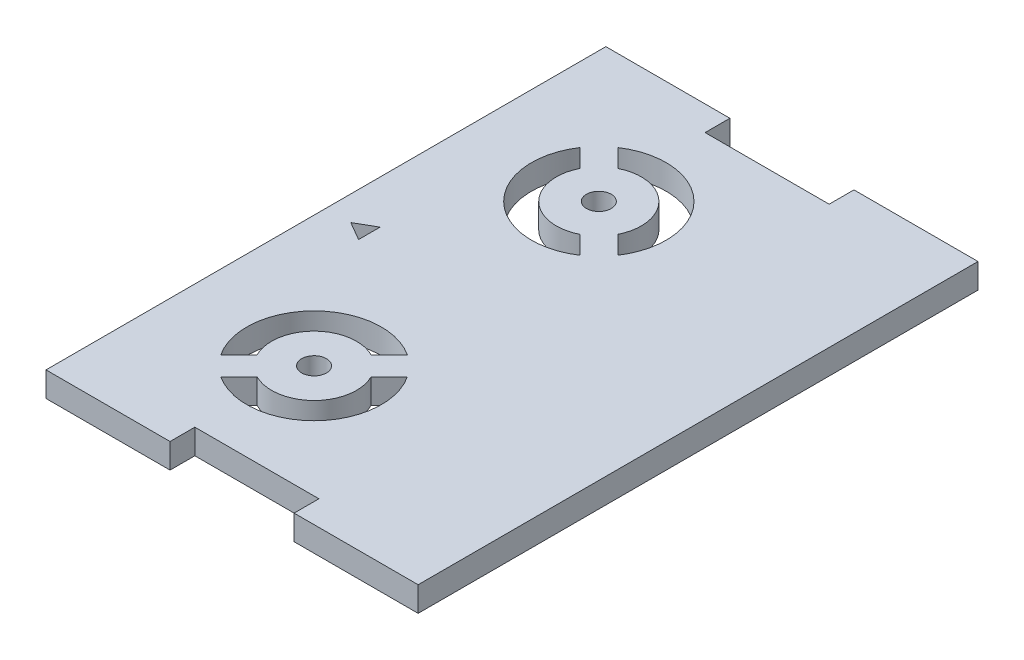
ISO-10303-21;
HEADER;
FILE_DESCRIPTION(('STEP AP214'),'2;1');
FILE_NAME('part.step','',(''),(''),'','','');
FILE_SCHEMA(('AUTOMOTIVE_DESIGN { 1 0 10303 214 1 1 1 1 }'));
ENDSEC;
DATA;
#1=APPLICATION_CONTEXT('core data for automotive mechanical design processes');
#2=APPLICATION_PROTOCOL_DEFINITION('international standard','automotive_design',2000,#1);
#3=PRODUCT_CONTEXT('',#1,'mechanical');
#4=PRODUCT('Part','Part','',(#3));
#5=PRODUCT_RELATED_PRODUCT_CATEGORY('part','',(#4));
#6=PRODUCT_DEFINITION_FORMATION('','',#4);
#7=PRODUCT_DEFINITION_CONTEXT('part definition',#1,'design');
#8=PRODUCT_DEFINITION('design','',#6,#7);
#9=PRODUCT_DEFINITION_SHAPE('','',#8);
#10=(LENGTH_UNIT() NAMED_UNIT(*) SI_UNIT(.MILLI.,.METRE.));
#11=(NAMED_UNIT(*) PLANE_ANGLE_UNIT() SI_UNIT($,.RADIAN.));
#12=(NAMED_UNIT(*) SI_UNIT($,.STERADIAN.) SOLID_ANGLE_UNIT());
#13=UNCERTAINTY_MEASURE_WITH_UNIT(LENGTH_MEASURE(1.E-05),#10,'distance_accuracy_value','');
#14=(GEOMETRIC_REPRESENTATION_CONTEXT(3) GLOBAL_UNCERTAINTY_ASSIGNED_CONTEXT((#13)) GLOBAL_UNIT_ASSIGNED_CONTEXT((#10,
#11,#12)) REPRESENTATION_CONTEXT('',''));
#15=CARTESIAN_POINT('',(0.,0.,0.));
#16=DIRECTION('',(0.,0.,1.));
#17=DIRECTION('',(1.,0.,0.));
#18=AXIS2_PLACEMENT_3D('',#15,#16,#17);
#19=CARTESIAN_POINT('',(22.5,1.5,33.85));
#20=DIRECTION('',(0.,0.,-1.));
#21=DIRECTION('',(-1.,0.,0.));
#22=AXIS2_PLACEMENT_3D('',#19,#20,#21);
#23=PLANE('',#22);
#24=DIRECTION('',(1.,0.,0.));
#25=VECTOR('',#24,1.);
#26=CARTESIAN_POINT('',(22.5,-1.5,33.85));
#27=LINE('',#26,#25);
#28=CARTESIAN_POINT('',(-22.5,-1.5,33.85));
#29=VERTEX_POINT('',#28);
#30=CARTESIAN_POINT('',(-7.50000000000002,-1.5,33.85));
#31=VERTEX_POINT('',#30);
#32=EDGE_CURVE('E476',#29,#31,#27,.T.);
#33=ORIENTED_EDGE('',*,*,#32,.T.);
#34=DIRECTION('',(0.,1.,0.));
#35=VECTOR('',#34,1.);
#36=CARTESIAN_POINT('',(-7.50000000000002,-1.5,33.85));
#37=LINE('',#36,#35);
#38=CARTESIAN_POINT('',(-7.50000000000002,1.5,33.85));
#39=VERTEX_POINT('',#38);
#40=EDGE_CURVE('E424',#31,#39,#37,.T.);
#41=ORIENTED_EDGE('',*,*,#40,.T.);
#42=DIRECTION('',(1.,0.,0.));
#43=VECTOR('',#42,1.);
#44=CARTESIAN_POINT('',(22.5,1.5,33.85));
#45=LINE('',#44,#43);
#46=CARTESIAN_POINT('',(-22.5,1.5,33.85));
#47=VERTEX_POINT('',#46);
#48=EDGE_CURVE('E463',#47,#39,#45,.T.);
#49=ORIENTED_EDGE('',*,*,#48,.F.);
#50=DIRECTION('',(0.,-1.,0.));
#51=VECTOR('',#50,1.);
#52=CARTESIAN_POINT('',(-22.5,1.5,33.85));
#53=LINE('',#52,#51);
#54=EDGE_CURVE('E11',#47,#29,#53,.T.);
#55=ORIENTED_EDGE('',*,*,#54,.T.);
#56=EDGE_LOOP('',(#33,#41,#49,#55));
#57=FACE_BOUND('',#56,.T.);
#58=ADVANCED_FACE('F35',(#57),#23,.F.);
#59=CARTESIAN_POINT('',(22.5,1.5,-33.85));
#60=DIRECTION('',(0.,0.,1.));
#61=DIRECTION('',(1.,0.,0.));
#62=AXIS2_PLACEMENT_3D('',#59,#60,#61);
#63=PLANE('',#62);
#64=DIRECTION('',(-1.,0.,0.));
#65=VECTOR('',#64,1.);
#66=CARTESIAN_POINT('',(22.5,-1.5,-33.85));
#67=LINE('',#66,#65);
#68=CARTESIAN_POINT('',(22.5,-1.5,-33.85));
#69=VERTEX_POINT('',#68);
#70=CARTESIAN_POINT('',(7.50000000000002,-1.5,-33.85));
#71=VERTEX_POINT('',#70);
#72=EDGE_CURVE('E462',#69,#71,#67,.T.);
#73=ORIENTED_EDGE('',*,*,#72,.T.);
#74=DIRECTION('',(0.,1.,0.));
#75=VECTOR('',#74,1.);
#76=CARTESIAN_POINT('',(7.50000000000002,-1.5,-33.85));
#77=LINE('',#76,#75);
#78=CARTESIAN_POINT('',(7.50000000000002,1.5,-33.85));
#79=VERTEX_POINT('',#78);
#80=EDGE_CURVE('E409',#71,#79,#77,.T.);
#81=ORIENTED_EDGE('',*,*,#80,.T.);
#82=DIRECTION('',(-1.,0.,0.));
#83=VECTOR('',#82,1.);
#84=CARTESIAN_POINT('',(22.5,1.5,-33.85));
#85=LINE('',#84,#83);
#86=CARTESIAN_POINT('',(22.5,1.5,-33.85));
#87=VERTEX_POINT('',#86);
#88=EDGE_CURVE('E469',#87,#79,#85,.T.);
#89=ORIENTED_EDGE('',*,*,#88,.F.);
#90=DIRECTION('',(0.,-1.,0.));
#91=VECTOR('',#90,1.);
#92=CARTESIAN_POINT('',(22.5,1.5,-33.85));
#93=LINE('',#92,#91);
#94=EDGE_CURVE('E486',#87,#69,#93,.T.);
#95=ORIENTED_EDGE('',*,*,#94,.T.);
#96=EDGE_LOOP('',(#73,#81,#89,#95));
#97=FACE_BOUND('',#96,.T.);
#98=ADVANCED_FACE('F503',(#97),#63,.F.);
#99=CARTESIAN_POINT('',(-22.5,1.5,33.85));
#100=DIRECTION('',(1.,0.,0.));
#101=DIRECTION('',(0.,0.,-1.));
#102=AXIS2_PLACEMENT_3D('',#99,#100,#101);
#103=PLANE('',#102);
#104=DIRECTION('',(0.,0.,1.));
#105=VECTOR('',#104,1.);
#106=CARTESIAN_POINT('',(-22.5,-1.5,33.85));
#107=LINE('',#106,#105);
#108=CARTESIAN_POINT('',(-22.5,-1.5,-33.85));
#109=VERTEX_POINT('',#108);
#110=EDGE_CURVE('E427',#109,#29,#107,.T.);
#111=ORIENTED_EDGE('',*,*,#110,.T.);
#112=ORIENTED_EDGE('',*,*,#54,.F.);
#113=DIRECTION('',(0.,0.,1.));
#114=VECTOR('',#113,1.);
#115=CARTESIAN_POINT('',(-22.5,1.5,33.85));
#116=LINE('',#115,#114);
#117=CARTESIAN_POINT('',(-22.5,1.5,-33.85));
#118=VERTEX_POINT('',#117);
#119=EDGE_CURVE('E458',#118,#47,#116,.T.);
#120=ORIENTED_EDGE('',*,*,#119,.F.);
#121=DIRECTION('',(0.,-1.,0.));
#122=VECTOR('',#121,1.);
#123=CARTESIAN_POINT('',(-22.5,1.5,-33.85));
#124=LINE('',#123,#122);
#125=EDGE_CURVE('E472',#118,#109,#124,.T.);
#126=ORIENTED_EDGE('',*,*,#125,.T.);
#127=EDGE_LOOP('',(#111,#112,#120,#126));
#128=FACE_BOUND('',#127,.T.);
#129=ADVANCED_FACE('F37',(#128),#103,.F.);
#130=CARTESIAN_POINT('',(7.50000000000002,1.5,33.85));
#131=VERTEX_POINT('',#130);
#132=CARTESIAN_POINT('',(22.5,1.5,33.85));
#133=VERTEX_POINT('',#132);
#134=EDGE_CURVE('E461',#131,#133,#45,.T.);
#135=ORIENTED_EDGE('',*,*,#134,.F.);
#136=DIRECTION('',(0.,1.,0.));
#137=VECTOR('',#136,1.);
#138=CARTESIAN_POINT('',(7.50000000000002,-1.5,33.85));
#139=LINE('',#138,#137);
#140=CARTESIAN_POINT('',(7.50000000000002,-1.5,33.85));
#141=VERTEX_POINT('',#140);
#142=EDGE_CURVE('E430',#141,#131,#139,.T.);
#143=ORIENTED_EDGE('',*,*,#142,.F.);
#144=CARTESIAN_POINT('',(22.5,-1.5,33.85));
#145=VERTEX_POINT('',#144);
#146=EDGE_CURVE('E475',#141,#145,#27,.T.);
#147=ORIENTED_EDGE('',*,*,#146,.T.);
#148=DIRECTION('',(0.,-1.,0.));
#149=VECTOR('',#148,1.);
#150=CARTESIAN_POINT('',(22.5,1.5,33.85));
#151=LINE('',#150,#149);
#152=EDGE_CURVE('E43',#133,#145,#151,.T.);
#153=ORIENTED_EDGE('',*,*,#152,.F.);
#154=EDGE_LOOP('',(#135,#143,#147,#153));
#155=FACE_BOUND('',#154,.T.);
#156=ADVANCED_FACE('F512',(#155),#23,.F.);
#157=CARTESIAN_POINT('',(22.5,1.5,33.85));
#158=DIRECTION('',(-1.,0.,0.));
#159=DIRECTION('',(0.,0.,1.));
#160=AXIS2_PLACEMENT_3D('',#157,#158,#159);
#161=PLANE('',#160);
#162=DIRECTION('',(0.,0.,-1.));
#163=VECTOR('',#162,1.);
#164=CARTESIAN_POINT('',(22.5,-1.5,33.85));
#165=LINE('',#164,#163);
#166=EDGE_CURVE('E479',#145,#69,#165,.T.);
#167=ORIENTED_EDGE('',*,*,#166,.T.);
#168=ORIENTED_EDGE('',*,*,#94,.F.);
#169=DIRECTION('',(0.,0.,-1.));
#170=VECTOR('',#169,1.);
#171=CARTESIAN_POINT('',(22.5,1.5,33.85));
#172=LINE('',#171,#170);
#173=EDGE_CURVE('E466',#133,#87,#172,.T.);
#174=ORIENTED_EDGE('',*,*,#173,.F.);
#175=ORIENTED_EDGE('',*,*,#152,.T.);
#176=EDGE_LOOP('',(#167,#168,#174,#175));
#177=FACE_BOUND('',#176,.T.);
#178=ADVANCED_FACE('F493',(#177),#161,.F.);
#179=CARTESIAN_POINT('',(-7.50000000000002,1.5,-33.85));
#180=VERTEX_POINT('',#179);
#181=EDGE_CURVE('E468',#180,#118,#85,.T.);
#182=ORIENTED_EDGE('',*,*,#181,.F.);
#183=DIRECTION('',(0.,1.,0.));
#184=VECTOR('',#183,1.);
#185=CARTESIAN_POINT('',(-7.50000000000002,-1.5,-33.85));
#186=LINE('',#185,#184);
#187=CARTESIAN_POINT('',(-7.50000000000002,-1.5,-33.85));
#188=VERTEX_POINT('',#187);
#189=EDGE_CURVE('E450',#188,#180,#186,.T.);
#190=ORIENTED_EDGE('',*,*,#189,.F.);
#191=EDGE_CURVE('E481',#188,#109,#67,.T.);
#192=ORIENTED_EDGE('',*,*,#191,.T.);
#193=ORIENTED_EDGE('',*,*,#125,.F.);
#194=EDGE_LOOP('',(#182,#190,#192,#193));
#195=FACE_BOUND('',#194,.T.);
#196=ADVANCED_FACE('F532',(#195),#63,.F.);
#197=CARTESIAN_POINT('',(0.,1.5,0.));
#198=DIRECTION('',(0.,1.,0.));
#199=DIRECTION('',(0.,0.,1.));
#200=AXIS2_PLACEMENT_3D('',#197,#198,#199);
#201=PLANE('',#200);
#202=DIRECTION('',(-0.866025403784438,0.,0.5));
#203=VECTOR('',#202,1.);
#204=CARTESIAN_POINT('',(-17.25,1.5,-1.29903810567667));
#205=LINE('',#204,#203);
#206=CARTESIAN_POINT('',(-17.25,1.5,-1.29903810567667));
#207=VERTEX_POINT('',#206);
#208=CARTESIAN_POINT('',(-19.5,1.5,0.));
#209=VERTEX_POINT('',#208);
#210=EDGE_CURVE('E50',#207,#209,#205,.T.);
#211=ORIENTED_EDGE('',*,*,#210,.F.);
#212=DIRECTION('',(0.,0.,-1.));
#213=VECTOR('',#212,1.);
#214=CARTESIAN_POINT('',(-17.25,1.5,1.29903810567665));
#215=LINE('',#214,#213);
#216=CARTESIAN_POINT('',(-17.25,1.5,1.29903810567665));
#217=VERTEX_POINT('',#216);
#218=EDGE_CURVE('E240',#217,#207,#215,.T.);
#219=ORIENTED_EDGE('',*,*,#218,.F.);
#220=DIRECTION('',(0.866025403784439,0.,0.5));
#221=VECTOR('',#220,1.);
#222=CARTESIAN_POINT('',(-19.5,1.5,0.));
#223=LINE('',#222,#221);
#224=EDGE_CURVE('E248',#209,#217,#223,.T.);
#225=ORIENTED_EDGE('',*,*,#224,.F.);
#226=EDGE_LOOP('',(#211,#219,#225));
#227=FACE_BOUND('',#226,.T.);
#228=CARTESIAN_POINT('',(-6.7175144212722,1.5,17.2175144212722));
#229=DIRECTION('',(0.,1.,0.));
#230=DIRECTION('',(0.,0.,-1.));
#231=AXIS2_PLACEMENT_3D('',#228,#229,#230);
#232=CIRCLE('',#231,8.13941029804985);
#233=CARTESIAN_POINT('',(-11.2058474568234,1.5,24.0075708689006));
#234=VERTEX_POINT('',#233);
#235=CARTESIAN_POINT('',(0.0725420263561734,1.5,12.729181385721));
#236=VERTEX_POINT('',#235);
#237=EDGE_CURVE('E291',#234,#236,#232,.T.);
#238=ORIENTED_EDGE('',*,*,#237,.F.);
#239=DIRECTION('',(-0.707106781186549,0.,0.707106781186546));
#240=VECTOR('',#239,1.);
#241=CARTESIAN_POINT('',(-9.01372196887857,1.5,21.8154453809557));
#242=LINE('',#241,#240);
#243=CARTESIAN_POINT('',(-9.01372196887858,1.5,21.8154453809557));
#244=VERTEX_POINT('',#243);
#245=EDGE_CURVE('E339',#244,#234,#242,.T.);
#246=ORIENTED_EDGE('',*,*,#245,.F.);
#247=CARTESIAN_POINT('',(-6.7175144212722,1.5,17.2175144212722));
#248=DIRECTION('',(0.,-1.,0.));
#249=DIRECTION('',(0.,0.,-1.));
#250=AXIS2_PLACEMENT_3D('',#247,#248,#249);
#251=CIRCLE('',#250,5.13941029804986);
#252=CARTESIAN_POINT('',(-2.11958346158865,1.5,14.9213068736658));
#253=VERTEX_POINT('',#252);
#254=EDGE_CURVE('E336',#253,#244,#251,.T.);
#255=ORIENTED_EDGE('',*,*,#254,.F.);
#256=DIRECTION('',(-0.707106781186545,0.,0.70710678118655));
#257=VECTOR('',#256,1.);
#258=CARTESIAN_POINT('',(0.0725420263561743,1.5,12.729181385721));
#259=LINE('',#258,#257);
#260=EDGE_CURVE('E333',#236,#253,#259,.T.);
#261=ORIENTED_EDGE('',*,*,#260,.F.);
#262=EDGE_LOOP('',(#238,#246,#255,#261));
#263=FACE_BOUND('',#262,.T.);
#264=CARTESIAN_POINT('',(-6.7175144212722,1.5,-17.2175144212722));
#265=DIRECTION('',(0.,1.,0.));
#266=DIRECTION('',(0.,0.,1.));
#267=AXIS2_PLACEMENT_3D('',#264,#265,#266);
#268=CIRCLE('',#267,8.13941029804985);
#269=CARTESIAN_POINT('',(0.0725420263561743,1.5,-12.729181385721));
#270=VERTEX_POINT('',#269);
#271=CARTESIAN_POINT('',(-11.2058474568234,1.5,-24.0075708689006));
#272=VERTEX_POINT('',#271);
#273=EDGE_CURVE('E298',#270,#272,#268,.T.);
#274=ORIENTED_EDGE('',*,*,#273,.F.);
#275=DIRECTION('',(0.707106781186545,0.,0.70710678118655));
#276=VECTOR('',#275,1.);
#277=CARTESIAN_POINT('',(0.0725420263561743,1.5,-12.729181385721));
#278=LINE('',#277,#276);
#279=CARTESIAN_POINT('',(-2.11958346158865,1.5,-14.9213068736658));
#280=VERTEX_POINT('',#279);
#281=EDGE_CURVE('E307',#280,#270,#278,.T.);
#282=ORIENTED_EDGE('',*,*,#281,.F.);
#283=CARTESIAN_POINT('',(-6.7175144212722,1.5,-17.2175144212722));
#284=DIRECTION('',(0.,-1.,0.));
#285=DIRECTION('',(0.,0.,1.));
#286=AXIS2_PLACEMENT_3D('',#283,#284,#285);
#287=CIRCLE('',#286,5.13941029804986);
#288=CARTESIAN_POINT('',(-9.01372196887858,1.5,-21.8154453809557));
#289=VERTEX_POINT('',#288);
#290=EDGE_CURVE('E304',#289,#280,#287,.T.);
#291=ORIENTED_EDGE('',*,*,#290,.F.);
#292=DIRECTION('',(0.707106781186549,0.,0.707106781186546));
#293=VECTOR('',#292,1.);
#294=CARTESIAN_POINT('',(-9.01372196887857,1.5,-21.8154453809557));
#295=LINE('',#294,#293);
#296=EDGE_CURVE('E300',#272,#289,#295,.T.);
#297=ORIENTED_EDGE('',*,*,#296,.F.);
#298=EDGE_LOOP('',(#274,#282,#291,#297));
#299=FACE_BOUND('',#298,.T.);
#300=CARTESIAN_POINT('',(-6.7175144212722,1.5,-17.2175144212722));
#301=DIRECTION('',(0.,1.,0.));
#302=DIRECTION('',(0.,0.,-1.));
#303=AXIS2_PLACEMENT_3D('',#300,#301,#302);
#304=CIRCLE('',#303,1.5);
#305=CARTESIAN_POINT('',(-6.7175144212722,1.5,-18.7175144212722));
#306=VERTEX_POINT('',#305);
#307=EDGE_CURVE('E387',#306,#306,#304,.T.);
#308=ORIENTED_EDGE('',*,*,#307,.F.);
#309=EDGE_LOOP('',(#308));
#310=FACE_BOUND('',#309,.T.);
#311=CARTESIAN_POINT('',(-6.7175144212722,1.5,-17.2175144212722));
#312=DIRECTION('',(0.,-1.,0.));
#313=DIRECTION('',(0.,0.,1.));
#314=AXIS2_PLACEMENT_3D('',#311,#312,#313);
#315=CIRCLE('',#314,5.13941029804986);
#316=CARTESIAN_POINT('',(-4.42130687366584,1.5,-12.6195834615886));
#317=VERTEX_POINT('',#316);
#318=CARTESIAN_POINT('',(-11.3154453809557,1.5,-19.5137219688786));
#319=VERTEX_POINT('',#318);
#320=EDGE_CURVE('E325',#317,#319,#315,.T.);
#321=ORIENTED_EDGE('',*,*,#320,.F.);
#322=DIRECTION('',(-0.707106781186547,0.,-0.707106781186548));
#323=VECTOR('',#322,1.);
#324=CARTESIAN_POINT('',(-2.229181385721,1.5,-10.4274579736438));
#325=LINE('',#324,#323);
#326=CARTESIAN_POINT('',(-2.229181385721,1.5,-10.4274579736438));
#327=VERTEX_POINT('',#326);
#328=EDGE_CURVE('E369',#327,#317,#325,.T.);
#329=ORIENTED_EDGE('',*,*,#328,.F.);
#330=CARTESIAN_POINT('',(-6.7175144212722,1.5,-17.2175144212722));
#331=DIRECTION('',(0.,1.,0.));
#332=DIRECTION('',(0.,0.,1.));
#333=AXIS2_PLACEMENT_3D('',#330,#331,#332);
#334=CIRCLE('',#333,8.13941029804986);
#335=CARTESIAN_POINT('',(-13.5075708689006,1.5,-21.7058474568234));
#336=VERTEX_POINT('',#335);
#337=EDGE_CURVE('E366',#336,#327,#334,.T.);
#338=ORIENTED_EDGE('',*,*,#337,.F.);
#339=DIRECTION('',(-0.707106781186548,0.,-0.707106781186548));
#340=VECTOR('',#339,1.);
#341=CARTESIAN_POINT('',(-11.3154453809557,1.5,-19.5137219688786));
#342=LINE('',#341,#340);
#343=EDGE_CURVE('E363',#319,#336,#342,.T.);
#344=ORIENTED_EDGE('',*,*,#343,.F.);
#345=EDGE_LOOP('',(#321,#329,#338,#344));
#346=FACE_BOUND('',#345,.T.);
#347=CARTESIAN_POINT('',(-6.7175144212722,1.5,17.2175144212722));
#348=DIRECTION('',(0.,1.,0.));
#349=DIRECTION('',(0.,0.,-1.));
#350=AXIS2_PLACEMENT_3D('',#347,#348,#349);
#351=CIRCLE('',#350,8.13941029804986);
#352=CARTESIAN_POINT('',(-2.229181385721,1.5,10.4274579736438));
#353=VERTEX_POINT('',#352);
#354=CARTESIAN_POINT('',(-13.5075708689006,1.5,21.7058474568234));
#355=VERTEX_POINT('',#354);
#356=EDGE_CURVE('E263',#353,#355,#351,.T.);
#357=ORIENTED_EDGE('',*,*,#356,.F.);
#358=DIRECTION('',(0.707106781186547,0.,-0.707106781186548));
#359=VECTOR('',#358,1.);
#360=CARTESIAN_POINT('',(-2.229181385721,1.5,10.4274579736438));
#361=LINE('',#360,#359);
#362=CARTESIAN_POINT('',(-4.42130687366584,1.5,12.6195834615886));
#363=VERTEX_POINT('',#362);
#364=EDGE_CURVE('E273',#363,#353,#361,.T.);
#365=ORIENTED_EDGE('',*,*,#364,.F.);
#366=CARTESIAN_POINT('',(-6.7175144212722,1.5,17.2175144212722));
#367=DIRECTION('',(0.,-1.,0.));
#368=DIRECTION('',(0.,0.,-1.));
#369=AXIS2_PLACEMENT_3D('',#366,#367,#368);
#370=CIRCLE('',#369,5.13941029804986);
#371=CARTESIAN_POINT('',(-11.3154453809558,1.5,19.5137219688786));
#372=VERTEX_POINT('',#371);
#373=EDGE_CURVE('E270',#372,#363,#370,.T.);
#374=ORIENTED_EDGE('',*,*,#373,.F.);
#375=DIRECTION('',(0.707106781186548,0.,-0.707106781186548));
#376=VECTOR('',#375,1.);
#377=CARTESIAN_POINT('',(-11.3154453809557,1.5,19.5137219688786));
#378=LINE('',#377,#376);
#379=EDGE_CURVE('E267',#355,#372,#378,.T.);
#380=ORIENTED_EDGE('',*,*,#379,.F.);
#381=EDGE_LOOP('',(#357,#365,#374,#380));
#382=FACE_BOUND('',#381,.T.);
#383=CARTESIAN_POINT('',(-6.7175144212722,1.5,17.2175144212722));
#384=DIRECTION('',(0.,1.,0.));
#385=DIRECTION('',(0.,0.,1.));
#386=AXIS2_PLACEMENT_3D('',#383,#384,#385);
#387=CIRCLE('',#386,1.5);
#388=CARTESIAN_POINT('',(-6.7175144212722,1.5,18.7175144212722));
#389=VERTEX_POINT('',#388);
#390=EDGE_CURVE('E399',#389,#389,#387,.T.);
#391=ORIENTED_EDGE('',*,*,#390,.F.);
#392=EDGE_LOOP('',(#391));
#393=FACE_BOUND('',#392,.T.);
#394=DIRECTION('',(0.,0.,1.));
#395=VECTOR('',#394,1.);
#396=CARTESIAN_POINT('',(-7.50000000000002,1.5,33.85));
#397=LINE('',#396,#395);
#398=CARTESIAN_POINT('',(-7.50000000000002,1.5,30.85));
#399=VERTEX_POINT('',#398);
#400=EDGE_CURVE('E406',#399,#39,#397,.T.);
#401=ORIENTED_EDGE('',*,*,#400,.F.);
#402=DIRECTION('',(-1.,0.,0.));
#403=VECTOR('',#402,1.);
#404=CARTESIAN_POINT('',(-7.50000000000002,1.5,30.85));
#405=LINE('',#404,#403);
#406=CARTESIAN_POINT('',(7.49999999999998,1.5,30.85));
#407=VERTEX_POINT('',#406);
#408=EDGE_CURVE('E412',#407,#399,#405,.T.);
#409=ORIENTED_EDGE('',*,*,#408,.F.);
#410=DIRECTION('',(0.,0.,-1.));
#411=VECTOR('',#410,1.);
#412=CARTESIAN_POINT('',(7.50000000000002,1.5,33.85));
#413=LINE('',#412,#411);
#414=EDGE_CURVE('E408',#131,#407,#413,.T.);
#415=ORIENTED_EDGE('',*,*,#414,.F.);
#416=ORIENTED_EDGE('',*,*,#134,.T.);
#417=ORIENTED_EDGE('',*,*,#173,.T.);
#418=ORIENTED_EDGE('',*,*,#88,.T.);
#419=DIRECTION('',(0.,0.,-1.));
#420=VECTOR('',#419,1.);
#421=CARTESIAN_POINT('',(7.50000000000002,1.5,-33.85));
#422=LINE('',#421,#420);
#423=CARTESIAN_POINT('',(7.49999999999998,1.5,-30.85));
#424=VERTEX_POINT('',#423);
#425=EDGE_CURVE('E439',#424,#79,#422,.T.);
#426=ORIENTED_EDGE('',*,*,#425,.F.);
#427=DIRECTION('',(1.,0.,0.));
#428=VECTOR('',#427,1.);
#429=CARTESIAN_POINT('',(-7.49999999999998,1.5,-30.85));
#430=LINE('',#429,#428);
#431=CARTESIAN_POINT('',(-7.49999999999998,1.5,-30.85));
#432=VERTEX_POINT('',#431);
#433=EDGE_CURVE('E436',#432,#424,#430,.T.);
#434=ORIENTED_EDGE('',*,*,#433,.F.);
#435=DIRECTION('',(0.,0.,1.));
#436=VECTOR('',#435,1.);
#437=CARTESIAN_POINT('',(-7.50000000000002,1.5,-33.85));
#438=LINE('',#437,#436);
#439=EDGE_CURVE('E405',#180,#432,#438,.T.);
#440=ORIENTED_EDGE('',*,*,#439,.F.);
#441=ORIENTED_EDGE('',*,*,#181,.T.);
#442=ORIENTED_EDGE('',*,*,#119,.T.);
#443=ORIENTED_EDGE('',*,*,#48,.T.);
#444=EDGE_LOOP('',(#401,#409,#415,#416,#417,#418,#426,#434,#440,#441,#442,#443));
#445=FACE_BOUND('',#444,.T.);
#446=ADVANCED_FACE('F252',(#227,#263,#299,#310,#346,#382,#393,#445),#201,.T.);
#447=CARTESIAN_POINT('',(0.,-1.5,0.));
#448=DIRECTION('',(0.,1.,0.));
#449=DIRECTION('',(0.,0.,1.));
#450=AXIS2_PLACEMENT_3D('',#447,#448,#449);
#451=PLANE('',#450);
#452=DIRECTION('',(0.,0.,-1.));
#453=VECTOR('',#452,1.);
#454=CARTESIAN_POINT('',(-17.25,-1.5,1.29903810567665));
#455=LINE('',#454,#453);
#456=CARTESIAN_POINT('',(-17.25,-1.5,1.29903810567665));
#457=VERTEX_POINT('',#456);
#458=CARTESIAN_POINT('',(-17.25,-1.5,-1.29903810567667));
#459=VERTEX_POINT('',#458);
#460=EDGE_CURVE('E58',#457,#459,#455,.T.);
#461=ORIENTED_EDGE('',*,*,#460,.T.);
#462=DIRECTION('',(-0.866025403784438,0.,0.5));
#463=VECTOR('',#462,1.);
#464=CARTESIAN_POINT('',(-17.25,-1.5,-1.29903810567667));
#465=LINE('',#464,#463);
#466=CARTESIAN_POINT('',(-19.5,-1.5,0.));
#467=VERTEX_POINT('',#466);
#468=EDGE_CURVE('E254',#459,#467,#465,.T.);
#469=ORIENTED_EDGE('',*,*,#468,.T.);
#470=DIRECTION('',(0.866025403784439,0.,0.5));
#471=VECTOR('',#470,1.);
#472=CARTESIAN_POINT('',(-19.5,-1.5,0.));
#473=LINE('',#472,#471);
#474=EDGE_CURVE('E257',#467,#457,#473,.T.);
#475=ORIENTED_EDGE('',*,*,#474,.T.);
#476=EDGE_LOOP('',(#461,#469,#475));
#477=FACE_BOUND('',#476,.T.);
#478=DIRECTION('',(-0.707106781186549,0.,0.707106781186546));
#479=VECTOR('',#478,1.);
#480=CARTESIAN_POINT('',(-9.01372196887857,-1.5,21.8154453809557));
#481=LINE('',#480,#479);
#482=CARTESIAN_POINT('',(-9.01372196887858,-1.5,21.8154453809557));
#483=VERTEX_POINT('',#482);
#484=CARTESIAN_POINT('',(-11.2058474568234,-1.5,24.0075708689006));
#485=VERTEX_POINT('',#484);
#486=EDGE_CURVE('E351',#483,#485,#481,.T.);
#487=ORIENTED_EDGE('',*,*,#486,.T.);
#488=CARTESIAN_POINT('',(-6.7175144212722,-1.5,17.2175144212722));
#489=DIRECTION('',(0.,1.,0.));
#490=DIRECTION('',(0.,0.,-1.));
#491=AXIS2_PLACEMENT_3D('',#488,#489,#490);
#492=CIRCLE('',#491,8.13941029804985);
#493=CARTESIAN_POINT('',(0.0725420263561743,-1.5,12.729181385721));
#494=VERTEX_POINT('',#493);
#495=EDGE_CURVE('E342',#485,#494,#492,.T.);
#496=ORIENTED_EDGE('',*,*,#495,.T.);
#497=DIRECTION('',(-0.707106781186545,0.,0.70710678118655));
#498=VECTOR('',#497,1.);
#499=CARTESIAN_POINT('',(0.0725420263561743,-1.5,12.729181385721));
#500=LINE('',#499,#498);
#501=CARTESIAN_POINT('',(-2.11958346158865,-1.5,14.9213068736658));
#502=VERTEX_POINT('',#501);
#503=EDGE_CURVE('E345',#494,#502,#500,.T.);
#504=ORIENTED_EDGE('',*,*,#503,.T.);
#505=CARTESIAN_POINT('',(-6.7175144212722,-1.5,17.2175144212722));
#506=DIRECTION('',(0.,-1.,0.));
#507=DIRECTION('',(0.,0.,-1.));
#508=AXIS2_PLACEMENT_3D('',#505,#506,#507);
#509=CIRCLE('',#508,5.13941029804986);
#510=EDGE_CURVE('E348',#502,#483,#509,.T.);
#511=ORIENTED_EDGE('',*,*,#510,.T.);
#512=EDGE_LOOP('',(#487,#496,#504,#511));
#513=FACE_BOUND('',#512,.T.);
#514=DIRECTION('',(0.707106781186545,0.,0.70710678118655));
#515=VECTOR('',#514,1.);
#516=CARTESIAN_POINT('',(0.0725420263561743,-1.5,-12.729181385721));
#517=LINE('',#516,#515);
#518=CARTESIAN_POINT('',(-2.11958346158865,-1.5,-14.9213068736658));
#519=VERTEX_POINT('',#518);
#520=CARTESIAN_POINT('',(0.0725420263561743,-1.5,-12.729181385721));
#521=VERTEX_POINT('',#520);
#522=EDGE_CURVE('E319',#519,#521,#517,.T.);
#523=ORIENTED_EDGE('',*,*,#522,.T.);
#524=CARTESIAN_POINT('',(-6.7175144212722,-1.5,-17.2175144212722));
#525=DIRECTION('',(0.,1.,0.));
#526=DIRECTION('',(0.,0.,1.));
#527=AXIS2_PLACEMENT_3D('',#524,#525,#526);
#528=CIRCLE('',#527,8.13941029804985);
#529=CARTESIAN_POINT('',(-11.2058474568234,-1.5,-24.0075708689006));
#530=VERTEX_POINT('',#529);
#531=EDGE_CURVE('E310',#521,#530,#528,.T.);
#532=ORIENTED_EDGE('',*,*,#531,.T.);
#533=DIRECTION('',(0.707106781186549,0.,0.707106781186546));
#534=VECTOR('',#533,1.);
#535=CARTESIAN_POINT('',(-9.01372196887857,-1.5,-21.8154453809557));
#536=LINE('',#535,#534);
#537=CARTESIAN_POINT('',(-9.01372196887858,-1.5,-21.8154453809557));
#538=VERTEX_POINT('',#537);
#539=EDGE_CURVE('E313',#530,#538,#536,.T.);
#540=ORIENTED_EDGE('',*,*,#539,.T.);
#541=CARTESIAN_POINT('',(-6.7175144212722,-1.5,-17.2175144212722));
#542=DIRECTION('',(0.,-1.,0.));
#543=DIRECTION('',(0.,0.,1.));
#544=AXIS2_PLACEMENT_3D('',#541,#542,#543);
#545=CIRCLE('',#544,5.13941029804986);
#546=EDGE_CURVE('E316',#538,#519,#545,.T.);
#547=ORIENTED_EDGE('',*,*,#546,.T.);
#548=EDGE_LOOP('',(#523,#532,#540,#547));
#549=FACE_BOUND('',#548,.T.);
#550=CARTESIAN_POINT('',(-6.7175144212722,-1.5,-17.2175144212722));
#551=DIRECTION('',(0.,1.,0.));
#552=DIRECTION('',(0.,0.,-1.));
#553=AXIS2_PLACEMENT_3D('',#550,#551,#552);
#554=CIRCLE('',#553,1.5);
#555=CARTESIAN_POINT('',(-6.7175144212722,-1.5,-18.7175144212722));
#556=VERTEX_POINT('',#555);
#557=EDGE_CURVE('E396',#556,#556,#554,.T.);
#558=ORIENTED_EDGE('',*,*,#557,.T.);
#559=EDGE_LOOP('',(#558));
#560=FACE_BOUND('',#559,.T.);
#561=DIRECTION('',(-0.707106781186547,0.,-0.707106781186548));
#562=VECTOR('',#561,1.);
#563=CARTESIAN_POINT('',(-2.229181385721,-1.5,-10.4274579736438));
#564=LINE('',#563,#562);
#565=CARTESIAN_POINT('',(-2.229181385721,-1.5,-10.4274579736438));
#566=VERTEX_POINT('',#565);
#567=CARTESIAN_POINT('',(-4.42130687366584,-1.5,-12.6195834615886));
#568=VERTEX_POINT('',#567);
#569=EDGE_CURVE('E381',#566,#568,#564,.T.);
#570=ORIENTED_EDGE('',*,*,#569,.T.);
#571=CARTESIAN_POINT('',(-6.7175144212722,-1.5,-17.2175144212722));
#572=DIRECTION('',(0.,-1.,0.));
#573=DIRECTION('',(0.,0.,1.));
#574=AXIS2_PLACEMENT_3D('',#571,#572,#573);
#575=CIRCLE('',#574,5.13941029804986);
#576=CARTESIAN_POINT('',(-11.3154453809557,-1.5,-19.5137219688786));
#577=VERTEX_POINT('',#576);
#578=EDGE_CURVE('E372',#568,#577,#575,.T.);
#579=ORIENTED_EDGE('',*,*,#578,.T.);
#580=DIRECTION('',(-0.707106781186548,0.,-0.707106781186548));
#581=VECTOR('',#580,1.);
#582=CARTESIAN_POINT('',(-11.3154453809557,-1.5,-19.5137219688786));
#583=LINE('',#582,#581);
#584=CARTESIAN_POINT('',(-13.5075708689006,-1.5,-21.7058474568234));
#585=VERTEX_POINT('',#584);
#586=EDGE_CURVE('E375',#577,#585,#583,.T.);
#587=ORIENTED_EDGE('',*,*,#586,.T.);
#588=CARTESIAN_POINT('',(-6.7175144212722,-1.5,-17.2175144212722));
#589=DIRECTION('',(0.,1.,0.));
#590=DIRECTION('',(0.,0.,1.));
#591=AXIS2_PLACEMENT_3D('',#588,#589,#590);
#592=CIRCLE('',#591,8.13941029804986);
#593=EDGE_CURVE('E378',#585,#566,#592,.T.);
#594=ORIENTED_EDGE('',*,*,#593,.T.);
#595=EDGE_LOOP('',(#570,#579,#587,#594));
#596=FACE_BOUND('',#595,.T.);
#597=DIRECTION('',(0.707106781186547,0.,-0.707106781186548));
#598=VECTOR('',#597,1.);
#599=CARTESIAN_POINT('',(-2.229181385721,-1.5,10.4274579736438));
#600=LINE('',#599,#598);
#601=CARTESIAN_POINT('',(-4.42130687366584,-1.5,12.6195834615886));
#602=VERTEX_POINT('',#601);
#603=CARTESIAN_POINT('',(-2.229181385721,-1.5,10.4274579736438));
#604=VERTEX_POINT('',#603);
#605=EDGE_CURVE('E285',#602,#604,#600,.T.);
#606=ORIENTED_EDGE('',*,*,#605,.T.);
#607=CARTESIAN_POINT('',(-6.7175144212722,-1.5,17.2175144212722));
#608=DIRECTION('',(0.,1.,0.));
#609=DIRECTION('',(0.,0.,-1.));
#610=AXIS2_PLACEMENT_3D('',#607,#608,#609);
#611=CIRCLE('',#610,8.13941029804986);
#612=CARTESIAN_POINT('',(-13.5075708689006,-1.5,21.7058474568234));
#613=VERTEX_POINT('',#612);
#614=EDGE_CURVE('E276',#604,#613,#611,.T.);
#615=ORIENTED_EDGE('',*,*,#614,.T.);
#616=DIRECTION('',(0.707106781186548,0.,-0.707106781186548));
#617=VECTOR('',#616,1.);
#618=CARTESIAN_POINT('',(-11.3154453809557,-1.5,19.5137219688786));
#619=LINE('',#618,#617);
#620=CARTESIAN_POINT('',(-11.3154453809558,-1.5,19.5137219688786));
#621=VERTEX_POINT('',#620);
#622=EDGE_CURVE('E279',#613,#621,#619,.T.);
#623=ORIENTED_EDGE('',*,*,#622,.T.);
#624=CARTESIAN_POINT('',(-6.7175144212722,-1.5,17.2175144212722));
#625=DIRECTION('',(0.,-1.,0.));
#626=DIRECTION('',(0.,0.,-1.));
#627=AXIS2_PLACEMENT_3D('',#624,#625,#626);
#628=CIRCLE('',#627,5.13941029804986);
#629=EDGE_CURVE('E282',#621,#602,#628,.T.);
#630=ORIENTED_EDGE('',*,*,#629,.T.);
#631=EDGE_LOOP('',(#606,#615,#623,#630));
#632=FACE_BOUND('',#631,.T.);
#633=CARTESIAN_POINT('',(-6.7175144212722,-1.5,17.2175144212722));
#634=DIRECTION('',(0.,1.,0.));
#635=DIRECTION('',(0.,0.,1.));
#636=AXIS2_PLACEMENT_3D('',#633,#634,#635);
#637=CIRCLE('',#636,1.5);
#638=CARTESIAN_POINT('',(-6.7175144212722,-1.5,18.7175144212722));
#639=VERTEX_POINT('',#638);
#640=EDGE_CURVE('E402',#639,#639,#637,.T.);
#641=ORIENTED_EDGE('',*,*,#640,.T.);
#642=EDGE_LOOP('',(#641));
#643=FACE_BOUND('',#642,.T.);
#644=DIRECTION('',(-1.,0.,0.));
#645=VECTOR('',#644,1.);
#646=CARTESIAN_POINT('',(-7.50000000000002,-1.5,30.85));
#647=LINE('',#646,#645);
#648=CARTESIAN_POINT('',(7.49999999999998,-1.5,30.85));
#649=VERTEX_POINT('',#648);
#650=CARTESIAN_POINT('',(-7.50000000000002,-1.5,30.85));
#651=VERTEX_POINT('',#650);
#652=EDGE_CURVE('E421',#649,#651,#647,.T.);
#653=ORIENTED_EDGE('',*,*,#652,.T.);
#654=DIRECTION('',(0.,0.,1.));
#655=VECTOR('',#654,1.);
#656=CARTESIAN_POINT('',(-7.50000000000002,-1.5,33.85));
#657=LINE('',#656,#655);
#658=EDGE_CURVE('E415',#651,#31,#657,.T.);
#659=ORIENTED_EDGE('',*,*,#658,.T.);
#660=ORIENTED_EDGE('',*,*,#32,.F.);
#661=ORIENTED_EDGE('',*,*,#110,.F.);
#662=ORIENTED_EDGE('',*,*,#191,.F.);
#663=DIRECTION('',(0.,0.,1.));
#664=VECTOR('',#663,1.);
#665=CARTESIAN_POINT('',(-7.50000000000002,-1.5,-33.85));
#666=LINE('',#665,#664);
#667=CARTESIAN_POINT('',(-7.49999999999998,-1.5,-30.85));
#668=VERTEX_POINT('',#667);
#669=EDGE_CURVE('E441',#188,#668,#666,.T.);
#670=ORIENTED_EDGE('',*,*,#669,.T.);
#671=DIRECTION('',(1.,0.,0.));
#672=VECTOR('',#671,1.);
#673=CARTESIAN_POINT('',(-7.49999999999998,-1.5,-30.85));
#674=LINE('',#673,#672);
#675=CARTESIAN_POINT('',(7.49999999999998,-1.5,-30.85));
#676=VERTEX_POINT('',#675);
#677=EDGE_CURVE('E444',#668,#676,#674,.T.);
#678=ORIENTED_EDGE('',*,*,#677,.T.);
#679=DIRECTION('',(0.,0.,-1.));
#680=VECTOR('',#679,1.);
#681=CARTESIAN_POINT('',(7.50000000000002,-1.5,-33.85));
#682=LINE('',#681,#680);
#683=EDGE_CURVE('E447',#676,#71,#682,.T.);
#684=ORIENTED_EDGE('',*,*,#683,.T.);
#685=ORIENTED_EDGE('',*,*,#72,.F.);
#686=ORIENTED_EDGE('',*,*,#166,.F.);
#687=ORIENTED_EDGE('',*,*,#146,.F.);
#688=DIRECTION('',(0.,0.,-1.));
#689=VECTOR('',#688,1.);
#690=CARTESIAN_POINT('',(7.50000000000002,-1.5,33.85));
#691=LINE('',#690,#689);
#692=EDGE_CURVE('E418',#141,#649,#691,.T.);
#693=ORIENTED_EDGE('',*,*,#692,.T.);
#694=EDGE_LOOP('',(#653,#659,#660,#661,#662,#670,#678,#684,#685,#686,#687,#693));
#695=FACE_BOUND('',#694,.T.);
#696=ADVANCED_FACE('F500',(#477,#513,#549,#560,#596,#632,#643,#695),#451,.F.);
#697=CARTESIAN_POINT('',(7.50000000000002,-1.5,-33.85));
#698=DIRECTION('',(1.,0.,0.));
#699=DIRECTION('',(0.,0.,-1.));
#700=AXIS2_PLACEMENT_3D('',#697,#698,#699);
#701=PLANE('',#700);
#702=ORIENTED_EDGE('',*,*,#80,.F.);
#703=ORIENTED_EDGE('',*,*,#683,.F.);
#704=DIRECTION('',(0.,1.,0.));
#705=VECTOR('',#704,1.);
#706=CARTESIAN_POINT('',(7.49999999999998,-1.5,-30.85));
#707=LINE('',#706,#705);
#708=EDGE_CURVE('E453',#676,#424,#707,.T.);
#709=ORIENTED_EDGE('',*,*,#708,.T.);
#710=ORIENTED_EDGE('',*,*,#425,.T.);
#711=EDGE_LOOP('',(#702,#703,#709,#710));
#712=FACE_BOUND('',#711,.T.);
#713=ADVANCED_FACE('F539',(#712),#701,.F.);
#714=CARTESIAN_POINT('',(-7.49999999999998,-1.5,-30.85));
#715=DIRECTION('',(0.,0.,1.));
#716=DIRECTION('',(1.,0.,0.));
#717=AXIS2_PLACEMENT_3D('',#714,#715,#716);
#718=PLANE('',#717);
#719=ORIENTED_EDGE('',*,*,#708,.F.);
#720=ORIENTED_EDGE('',*,*,#677,.F.);
#721=DIRECTION('',(0.,1.,0.));
#722=VECTOR('',#721,1.);
#723=CARTESIAN_POINT('',(-7.49999999999998,-1.5,-30.85));
#724=LINE('',#723,#722);
#725=EDGE_CURVE('E455',#668,#432,#724,.T.);
#726=ORIENTED_EDGE('',*,*,#725,.T.);
#727=ORIENTED_EDGE('',*,*,#433,.T.);
#728=EDGE_LOOP('',(#719,#720,#726,#727));
#729=FACE_BOUND('',#728,.T.);
#730=ADVANCED_FACE('F537',(#729),#718,.F.);
#731=CARTESIAN_POINT('',(-7.50000000000002,-1.5,-33.85));
#732=DIRECTION('',(-1.,0.,0.));
#733=DIRECTION('',(0.,0.,1.));
#734=AXIS2_PLACEMENT_3D('',#731,#732,#733);
#735=PLANE('',#734);
#736=ORIENTED_EDGE('',*,*,#725,.F.);
#737=ORIENTED_EDGE('',*,*,#669,.F.);
#738=ORIENTED_EDGE('',*,*,#189,.T.);
#739=ORIENTED_EDGE('',*,*,#439,.T.);
#740=EDGE_LOOP('',(#736,#737,#738,#739));
#741=FACE_BOUND('',#740,.T.);
#742=ADVANCED_FACE('F535',(#741),#735,.F.);
#743=CARTESIAN_POINT('',(-7.50000000000002,-1.5,33.85));
#744=DIRECTION('',(-1.,0.,0.));
#745=DIRECTION('',(0.,0.,1.));
#746=AXIS2_PLACEMENT_3D('',#743,#744,#745);
#747=PLANE('',#746);
#748=ORIENTED_EDGE('',*,*,#40,.F.);
#749=ORIENTED_EDGE('',*,*,#658,.F.);
#750=DIRECTION('',(0.,1.,0.));
#751=VECTOR('',#750,1.);
#752=CARTESIAN_POINT('',(-7.50000000000002,-1.5,30.85));
#753=LINE('',#752,#751);
#754=EDGE_CURVE('E425',#651,#399,#753,.T.);
#755=ORIENTED_EDGE('',*,*,#754,.T.);
#756=ORIENTED_EDGE('',*,*,#400,.T.);
#757=EDGE_LOOP('',(#748,#749,#755,#756));
#758=FACE_BOUND('',#757,.T.);
#759=ADVANCED_FACE('F520',(#758),#747,.F.);
#760=CARTESIAN_POINT('',(-7.50000000000002,-1.5,30.85));
#761=DIRECTION('',(0.,0.,-1.));
#762=DIRECTION('',(-1.,0.,0.));
#763=AXIS2_PLACEMENT_3D('',#760,#761,#762);
#764=PLANE('',#763);
#765=ORIENTED_EDGE('',*,*,#754,.F.);
#766=ORIENTED_EDGE('',*,*,#652,.F.);
#767=DIRECTION('',(0.,1.,0.));
#768=VECTOR('',#767,1.);
#769=CARTESIAN_POINT('',(7.49999999999998,-1.5,30.85));
#770=LINE('',#769,#768);
#771=EDGE_CURVE('E428',#649,#407,#770,.T.);
#772=ORIENTED_EDGE('',*,*,#771,.T.);
#773=ORIENTED_EDGE('',*,*,#408,.T.);
#774=EDGE_LOOP('',(#765,#766,#772,#773));
#775=FACE_BOUND('',#774,.T.);
#776=ADVANCED_FACE('F518',(#775),#764,.F.);
#777=CARTESIAN_POINT('',(7.50000000000002,-1.5,33.85));
#778=DIRECTION('',(1.,0.,0.));
#779=DIRECTION('',(0.,0.,-1.));
#780=AXIS2_PLACEMENT_3D('',#777,#778,#779);
#781=PLANE('',#780);
#782=ORIENTED_EDGE('',*,*,#771,.F.);
#783=ORIENTED_EDGE('',*,*,#692,.F.);
#784=ORIENTED_EDGE('',*,*,#142,.T.);
#785=ORIENTED_EDGE('',*,*,#414,.T.);
#786=EDGE_LOOP('',(#782,#783,#784,#785));
#787=FACE_BOUND('',#786,.T.);
#788=ADVANCED_FACE('F515',(#787),#781,.F.);
#789=CARTESIAN_POINT('',(-6.7175144212722,-1.5,17.2175144212722));
#790=DIRECTION('',(0.,1.,0.));
#791=DIRECTION('',(0.,0.,1.));
#792=AXIS2_PLACEMENT_3D('',#789,#790,#791);
#793=CYLINDRICAL_SURFACE('',#792,1.5);
#794=ORIENTED_EDGE('',*,*,#640,.F.);
#795=EDGE_LOOP('',(#794));
#796=FACE_BOUND('',#795,.T.);
#797=ORIENTED_EDGE('',*,*,#390,.T.);
#798=EDGE_LOOP('',(#797));
#799=FACE_BOUND('',#798,.T.);
#800=ADVANCED_FACE('F627',(#796,#799),#793,.F.);
#801=CARTESIAN_POINT('',(-6.7175144212722,-1.5,17.2175144212722));
#802=DIRECTION('',(0.,1.,0.));
#803=DIRECTION('',(0.,0.,1.));
#804=AXIS2_PLACEMENT_3D('',#801,#802,#803);
#805=CYLINDRICAL_SURFACE('',#804,8.13941029804986);
#806=DIRECTION('',(0.,1.,0.));
#807=VECTOR('',#806,1.);
#808=CARTESIAN_POINT('',(-13.5075708689006,-1.5,21.7058474568234));
#809=LINE('',#808,#807);
#810=EDGE_CURVE('E288',#613,#355,#809,.T.);
#811=ORIENTED_EDGE('',*,*,#810,.F.);
#812=ORIENTED_EDGE('',*,*,#614,.F.);
#813=DIRECTION('',(0.,1.,0.));
#814=VECTOR('',#813,1.);
#815=CARTESIAN_POINT('',(-2.229181385721,-1.5,10.4274579736438));
#816=LINE('',#815,#814);
#817=EDGE_CURVE('E289',#604,#353,#816,.T.);
#818=ORIENTED_EDGE('',*,*,#817,.T.);
#819=ORIENTED_EDGE('',*,*,#356,.T.);
#820=EDGE_LOOP('',(#811,#812,#818,#819));
#821=FACE_BOUND('',#820,.T.);
#822=ADVANCED_FACE('F636',(#821),#805,.F.);
#823=CARTESIAN_POINT('',(-2.229181385721,-1.5,10.4274579736438));
#824=DIRECTION('',(0.707106781186548,0.,0.707106781186547));
#825=DIRECTION('',(0.707106781186547,0.,-0.707106781186548));
#826=AXIS2_PLACEMENT_3D('',#823,#824,#825);
#827=PLANE('',#826);
#828=ORIENTED_EDGE('',*,*,#817,.F.);
#829=ORIENTED_EDGE('',*,*,#605,.F.);
#830=DIRECTION('',(0.,1.,0.));
#831=VECTOR('',#830,1.);
#832=CARTESIAN_POINT('',(-4.42130687366584,-1.5,12.6195834615886));
#833=LINE('',#832,#831);
#834=EDGE_CURVE('E292',#602,#363,#833,.T.);
#835=ORIENTED_EDGE('',*,*,#834,.T.);
#836=ORIENTED_EDGE('',*,*,#364,.T.);
#837=EDGE_LOOP('',(#828,#829,#835,#836));
#838=FACE_BOUND('',#837,.T.);
#839=ADVANCED_FACE('F646',(#838),#827,.F.);
#840=CARTESIAN_POINT('',(-6.7175144212722,-1.5,17.2175144212722));
#841=DIRECTION('',(0.,1.,0.));
#842=DIRECTION('',(0.,0.,1.));
#843=AXIS2_PLACEMENT_3D('',#840,#841,#842);
#844=CYLINDRICAL_SURFACE('',#843,5.13941029804986);
#845=ORIENTED_EDGE('',*,*,#834,.F.);
#846=ORIENTED_EDGE('',*,*,#629,.F.);
#847=DIRECTION('',(0.,1.,0.));
#848=VECTOR('',#847,1.);
#849=CARTESIAN_POINT('',(-11.3154453809558,-1.5,19.5137219688786));
#850=LINE('',#849,#848);
#851=EDGE_CURVE('E294',#621,#372,#850,.T.);
#852=ORIENTED_EDGE('',*,*,#851,.T.);
#853=ORIENTED_EDGE('',*,*,#373,.T.);
#854=EDGE_LOOP('',(#845,#846,#852,#853));
#855=FACE_BOUND('',#854,.T.);
#856=ADVANCED_FACE('F656',(#855),#844,.T.);
#857=CARTESIAN_POINT('',(-11.3154453809557,-1.5,19.5137219688786));
#858=DIRECTION('',(0.707106781186547,0.,0.707106781186547));
#859=DIRECTION('',(0.707106781186548,0.,-0.707106781186548));
#860=AXIS2_PLACEMENT_3D('',#857,#858,#859);
#861=PLANE('',#860);
#862=ORIENTED_EDGE('',*,*,#851,.F.);
#863=ORIENTED_EDGE('',*,*,#622,.F.);
#864=ORIENTED_EDGE('',*,*,#810,.T.);
#865=ORIENTED_EDGE('',*,*,#379,.T.);
#866=EDGE_LOOP('',(#862,#863,#864,#865));
#867=FACE_BOUND('',#866,.T.);
#868=ADVANCED_FACE('F666',(#867),#861,.F.);
#869=CARTESIAN_POINT('',(-6.7175144212722,-1.5,-17.2175144212722));
#870=DIRECTION('',(0.,1.,0.));
#871=DIRECTION('',(0.,0.,1.));
#872=AXIS2_PLACEMENT_3D('',#869,#870,#871);
#873=CYLINDRICAL_SURFACE('',#872,5.13941029804986);
#874=DIRECTION('',(0.,1.,0.));
#875=VECTOR('',#874,1.);
#876=CARTESIAN_POINT('',(-11.3154453809557,-1.5,-19.5137219688786));
#877=LINE('',#876,#875);
#878=EDGE_CURVE('E384',#577,#319,#877,.T.);
#879=ORIENTED_EDGE('',*,*,#878,.F.);
#880=ORIENTED_EDGE('',*,*,#578,.F.);
#881=DIRECTION('',(0.,1.,0.));
#882=VECTOR('',#881,1.);
#883=CARTESIAN_POINT('',(-4.42130687366584,-1.5,-12.6195834615886));
#884=LINE('',#883,#882);
#885=EDGE_CURVE('E385',#568,#317,#884,.T.);
#886=ORIENTED_EDGE('',*,*,#885,.T.);
#887=ORIENTED_EDGE('',*,*,#320,.T.);
#888=EDGE_LOOP('',(#879,#880,#886,#887));
#889=FACE_BOUND('',#888,.T.);
#890=ADVANCED_FACE('F676',(#889),#873,.T.);
#891=CARTESIAN_POINT('',(-2.229181385721,-1.5,-10.4274579736438));
#892=DIRECTION('',(0.707106781186548,0.,-0.707106781186547));
#893=DIRECTION('',(-0.707106781186547,0.,-0.707106781186548));
#894=AXIS2_PLACEMENT_3D('',#891,#892,#893);
#895=PLANE('',#894);
#896=ORIENTED_EDGE('',*,*,#885,.F.);
#897=ORIENTED_EDGE('',*,*,#569,.F.);
#898=DIRECTION('',(0.,1.,0.));
#899=VECTOR('',#898,1.);
#900=CARTESIAN_POINT('',(-2.229181385721,-1.5,-10.4274579736438));
#901=LINE('',#900,#899);
#902=EDGE_CURVE('E388',#566,#327,#901,.T.);
#903=ORIENTED_EDGE('',*,*,#902,.T.);
#904=ORIENTED_EDGE('',*,*,#328,.T.);
#905=EDGE_LOOP('',(#896,#897,#903,#904));
#906=FACE_BOUND('',#905,.T.);
#907=ADVANCED_FACE('F686',(#906),#895,.F.);
#908=CARTESIAN_POINT('',(-6.7175144212722,-1.5,-17.2175144212722));
#909=DIRECTION('',(0.,1.,0.));
#910=DIRECTION('',(0.,0.,1.));
#911=AXIS2_PLACEMENT_3D('',#908,#909,#910);
#912=CYLINDRICAL_SURFACE('',#911,8.13941029804986);
#913=ORIENTED_EDGE('',*,*,#902,.F.);
#914=ORIENTED_EDGE('',*,*,#593,.F.);
#915=DIRECTION('',(0.,1.,0.));
#916=VECTOR('',#915,1.);
#917=CARTESIAN_POINT('',(-13.5075708689006,-1.5,-21.7058474568234));
#918=LINE('',#917,#916);
#919=EDGE_CURVE('E390',#585,#336,#918,.T.);
#920=ORIENTED_EDGE('',*,*,#919,.T.);
#921=ORIENTED_EDGE('',*,*,#337,.T.);
#922=EDGE_LOOP('',(#913,#914,#920,#921));
#923=FACE_BOUND('',#922,.T.);
#924=ADVANCED_FACE('F696',(#923),#912,.F.);
#925=CARTESIAN_POINT('',(-11.3154453809557,-1.5,-19.5137219688786));
#926=DIRECTION('',(0.707106781186547,0.,-0.707106781186547));
#927=DIRECTION('',(-0.707106781186548,0.,-0.707106781186548));
#928=AXIS2_PLACEMENT_3D('',#925,#926,#927);
#929=PLANE('',#928);
#930=ORIENTED_EDGE('',*,*,#919,.F.);
#931=ORIENTED_EDGE('',*,*,#586,.F.);
#932=ORIENTED_EDGE('',*,*,#878,.T.);
#933=ORIENTED_EDGE('',*,*,#343,.T.);
#934=EDGE_LOOP('',(#930,#931,#932,#933));
#935=FACE_BOUND('',#934,.T.);
#936=ADVANCED_FACE('F706',(#935),#929,.F.);
#937=CARTESIAN_POINT('',(-6.7175144212722,-1.5,-17.2175144212722));
#938=DIRECTION('',(0.,1.,0.));
#939=DIRECTION('',(0.,0.,1.));
#940=AXIS2_PLACEMENT_3D('',#937,#938,#939);
#941=CYLINDRICAL_SURFACE('',#940,1.5);
#942=ORIENTED_EDGE('',*,*,#557,.F.);
#943=EDGE_LOOP('',(#942));
#944=FACE_BOUND('',#943,.T.);
#945=ORIENTED_EDGE('',*,*,#307,.T.);
#946=EDGE_LOOP('',(#945));
#947=FACE_BOUND('',#946,.T.);
#948=ADVANCED_FACE('F716',(#944,#947),#941,.F.);
#949=CARTESIAN_POINT('',(-6.7175144212722,-1.5,-17.2175144212722));
#950=DIRECTION('',(0.,1.,0.));
#951=DIRECTION('',(0.,0.,1.));
#952=AXIS2_PLACEMENT_3D('',#949,#950,#951);
#953=CYLINDRICAL_SURFACE('',#952,8.13941029804985);
#954=DIRECTION('',(0.,1.,0.));
#955=VECTOR('',#954,1.);
#956=CARTESIAN_POINT('',(-11.2058474568234,-1.5,-24.0075708689006));
#957=LINE('',#956,#955);
#958=EDGE_CURVE('E322',#530,#272,#957,.T.);
#959=ORIENTED_EDGE('',*,*,#958,.F.);
#960=ORIENTED_EDGE('',*,*,#531,.F.);
#961=DIRECTION('',(0.,1.,0.));
#962=VECTOR('',#961,1.);
#963=CARTESIAN_POINT('',(0.0725420263561743,-1.5,-12.729181385721));
#964=LINE('',#963,#962);
#965=EDGE_CURVE('E323',#521,#270,#964,.T.);
#966=ORIENTED_EDGE('',*,*,#965,.T.);
#967=ORIENTED_EDGE('',*,*,#273,.T.);
#968=EDGE_LOOP('',(#959,#960,#966,#967));
#969=FACE_BOUND('',#968,.T.);
#970=ADVANCED_FACE('F726',(#969),#953,.F.);
#971=CARTESIAN_POINT('',(0.0725420263561743,-1.5,-12.729181385721));
#972=DIRECTION('',(-0.70710678118655,0.,0.707106781186544));
#973=DIRECTION('',(0.707106781186545,0.,0.70710678118655));
#974=AXIS2_PLACEMENT_3D('',#971,#972,#973);
#975=PLANE('',#974);
#976=ORIENTED_EDGE('',*,*,#965,.F.);
#977=ORIENTED_EDGE('',*,*,#522,.F.);
#978=DIRECTION('',(0.,1.,0.));
#979=VECTOR('',#978,1.);
#980=CARTESIAN_POINT('',(-2.11958346158865,-1.5,-14.9213068736658));
#981=LINE('',#980,#979);
#982=EDGE_CURVE('E326',#519,#280,#981,.T.);
#983=ORIENTED_EDGE('',*,*,#982,.T.);
#984=ORIENTED_EDGE('',*,*,#281,.T.);
#985=EDGE_LOOP('',(#976,#977,#983,#984));
#986=FACE_BOUND('',#985,.T.);
#987=ADVANCED_FACE('F736',(#986),#975,.F.);
#988=CARTESIAN_POINT('',(-6.7175144212722,-1.5,-17.2175144212722));
#989=DIRECTION('',(0.,1.,0.));
#990=DIRECTION('',(0.,0.,1.));
#991=AXIS2_PLACEMENT_3D('',#988,#989,#990);
#992=CYLINDRICAL_SURFACE('',#991,5.13941029804986);
#993=ORIENTED_EDGE('',*,*,#982,.F.);
#994=ORIENTED_EDGE('',*,*,#546,.F.);
#995=DIRECTION('',(0.,1.,0.));
#996=VECTOR('',#995,1.);
#997=CARTESIAN_POINT('',(-9.01372196887858,-1.5,-21.8154453809557));
#998=LINE('',#997,#996);
#999=EDGE_CURVE('E328',#538,#289,#998,.T.);
#1000=ORIENTED_EDGE('',*,*,#999,.T.);
#1001=ORIENTED_EDGE('',*,*,#290,.T.);
#1002=EDGE_LOOP('',(#993,#994,#1000,#1001));
#1003=FACE_BOUND('',#1002,.T.);
#1004=ADVANCED_FACE('F746',(#1003),#992,.T.);
#1005=CARTESIAN_POINT('',(-9.01372196887857,-1.5,-21.8154453809557));
#1006=DIRECTION('',(-0.707106781186545,0.,0.707106781186549));
#1007=DIRECTION('',(0.707106781186549,0.,0.707106781186546));
#1008=AXIS2_PLACEMENT_3D('',#1005,#1006,#1007);
#1009=PLANE('',#1008);
#1010=ORIENTED_EDGE('',*,*,#999,.F.);
#1011=ORIENTED_EDGE('',*,*,#539,.F.);
#1012=ORIENTED_EDGE('',*,*,#958,.T.);
#1013=ORIENTED_EDGE('',*,*,#296,.T.);
#1014=EDGE_LOOP('',(#1010,#1011,#1012,#1013));
#1015=FACE_BOUND('',#1014,.T.);
#1016=ADVANCED_FACE('F756',(#1015),#1009,.F.);
#1017=CARTESIAN_POINT('',(-6.7175144212722,-1.5,17.2175144212722));
#1018=DIRECTION('',(0.,1.,0.));
#1019=DIRECTION('',(0.,0.,1.));
#1020=AXIS2_PLACEMENT_3D('',#1017,#1018,#1019);
#1021=CYLINDRICAL_SURFACE('',#1020,8.13941029804985);
#1022=DIRECTION('',(0.,1.,0.));
#1023=VECTOR('',#1022,1.);
#1024=CARTESIAN_POINT('',(0.0725420263561743,-1.5,12.729181385721));
#1025=LINE('',#1024,#1023);
#1026=EDGE_CURVE('E354',#494,#236,#1025,.T.);
#1027=ORIENTED_EDGE('',*,*,#1026,.F.);
#1028=ORIENTED_EDGE('',*,*,#495,.F.);
#1029=DIRECTION('',(0.,1.,0.));
#1030=VECTOR('',#1029,1.);
#1031=CARTESIAN_POINT('',(-11.2058474568234,-1.5,24.0075708689006));
#1032=LINE('',#1031,#1030);
#1033=EDGE_CURVE('E301',#485,#234,#1032,.T.);
#1034=ORIENTED_EDGE('',*,*,#1033,.T.);
#1035=ORIENTED_EDGE('',*,*,#237,.T.);
#1036=EDGE_LOOP('',(#1027,#1028,#1034,#1035));
#1037=FACE_BOUND('',#1036,.T.);
#1038=ADVANCED_FACE('F766',(#1037),#1021,.F.);
#1039=CARTESIAN_POINT('',(-9.01372196887857,-1.5,21.8154453809557));
#1040=DIRECTION('',(-0.707106781186545,0.,-0.707106781186549));
#1041=DIRECTION('',(-0.707106781186549,0.,0.707106781186546));
#1042=AXIS2_PLACEMENT_3D('',#1039,#1040,#1041);
#1043=PLANE('',#1042);
#1044=ORIENTED_EDGE('',*,*,#1033,.F.);
#1045=ORIENTED_EDGE('',*,*,#486,.F.);
#1046=DIRECTION('',(0.,1.,0.));
#1047=VECTOR('',#1046,1.);
#1048=CARTESIAN_POINT('',(-9.01372196887858,-1.5,21.8154453809557));
#1049=LINE('',#1048,#1047);
#1050=EDGE_CURVE('E356',#483,#244,#1049,.T.);
#1051=ORIENTED_EDGE('',*,*,#1050,.T.);
#1052=ORIENTED_EDGE('',*,*,#245,.T.);
#1053=EDGE_LOOP('',(#1044,#1045,#1051,#1052));
#1054=FACE_BOUND('',#1053,.T.);
#1055=ADVANCED_FACE('F776',(#1054),#1043,.F.);
#1056=CARTESIAN_POINT('',(-6.7175144212722,-1.5,17.2175144212722));
#1057=DIRECTION('',(0.,1.,0.));
#1058=DIRECTION('',(0.,0.,1.));
#1059=AXIS2_PLACEMENT_3D('',#1056,#1057,#1058);
#1060=CYLINDRICAL_SURFACE('',#1059,5.13941029804986);
#1061=ORIENTED_EDGE('',*,*,#1050,.F.);
#1062=ORIENTED_EDGE('',*,*,#510,.F.);
#1063=DIRECTION('',(0.,1.,0.));
#1064=VECTOR('',#1063,1.);
#1065=CARTESIAN_POINT('',(-2.11958346158865,-1.5,14.9213068736658));
#1066=LINE('',#1065,#1064);
#1067=EDGE_CURVE('E358',#502,#253,#1066,.T.);
#1068=ORIENTED_EDGE('',*,*,#1067,.T.);
#1069=ORIENTED_EDGE('',*,*,#254,.T.);
#1070=EDGE_LOOP('',(#1061,#1062,#1068,#1069));
#1071=FACE_BOUND('',#1070,.T.);
#1072=ADVANCED_FACE('F786',(#1071),#1060,.T.);
#1073=CARTESIAN_POINT('',(0.0725420263561743,-1.5,12.729181385721));
#1074=DIRECTION('',(-0.70710678118655,0.,-0.707106781186544));
#1075=DIRECTION('',(-0.707106781186545,0.,0.70710678118655));
#1076=AXIS2_PLACEMENT_3D('',#1073,#1074,#1075);
#1077=PLANE('',#1076);
#1078=ORIENTED_EDGE('',*,*,#1067,.F.);
#1079=ORIENTED_EDGE('',*,*,#503,.F.);
#1080=ORIENTED_EDGE('',*,*,#1026,.T.);
#1081=ORIENTED_EDGE('',*,*,#260,.T.);
#1082=EDGE_LOOP('',(#1078,#1079,#1080,#1081));
#1083=FACE_BOUND('',#1082,.T.);
#1084=ADVANCED_FACE('F796',(#1083),#1077,.F.);
#1085=CARTESIAN_POINT('',(-17.25,-1.5,-1.29903810567667));
#1086=DIRECTION('',(-0.500000000000001,0.,-0.866025403784438));
#1087=DIRECTION('',(-0.866025403784438,0.,0.500000000000001));
#1088=AXIS2_PLACEMENT_3D('',#1085,#1086,#1087);
#1089=PLANE('',#1088);
#1090=DIRECTION('',(0.,1.,0.));
#1091=VECTOR('',#1090,1.);
#1092=CARTESIAN_POINT('',(-19.5,-1.5,0.));
#1093=LINE('',#1092,#1091);
#1094=EDGE_CURVE('E245',#467,#209,#1093,.T.);
#1095=ORIENTED_EDGE('',*,*,#1094,.F.);
#1096=ORIENTED_EDGE('',*,*,#468,.F.);
#1097=DIRECTION('',(0.,1.,0.));
#1098=VECTOR('',#1097,1.);
#1099=CARTESIAN_POINT('',(-17.25,-1.5,-1.29903810567667));
#1100=LINE('',#1099,#1098);
#1101=EDGE_CURVE('E244',#459,#207,#1100,.T.);
#1102=ORIENTED_EDGE('',*,*,#1101,.T.);
#1103=ORIENTED_EDGE('',*,*,#210,.T.);
#1104=EDGE_LOOP('',(#1095,#1096,#1102,#1103));
#1105=FACE_BOUND('',#1104,.T.);
#1106=ADVANCED_FACE('F806',(#1105),#1089,.F.);
#1107=CARTESIAN_POINT('',(-17.25,-1.5,1.29903810567665));
#1108=DIRECTION('',(1.,0.,0.));
#1109=DIRECTION('',(0.,0.,-1.));
#1110=AXIS2_PLACEMENT_3D('',#1107,#1108,#1109);
#1111=PLANE('',#1110);
#1112=ORIENTED_EDGE('',*,*,#1101,.F.);
#1113=ORIENTED_EDGE('',*,*,#460,.F.);
#1114=DIRECTION('',(0.,1.,0.));
#1115=VECTOR('',#1114,1.);
#1116=CARTESIAN_POINT('',(-17.25,-1.5,1.29903810567665));
#1117=LINE('',#1116,#1115);
#1118=EDGE_CURVE('E236',#457,#217,#1117,.T.);
#1119=ORIENTED_EDGE('',*,*,#1118,.T.);
#1120=ORIENTED_EDGE('',*,*,#218,.T.);
#1121=EDGE_LOOP('',(#1112,#1113,#1119,#1120));
#1122=FACE_BOUND('',#1121,.T.);
#1123=ADVANCED_FACE('F238',(#1122),#1111,.F.);
#1124=CARTESIAN_POINT('',(-19.5,-1.5,0.));
#1125=DIRECTION('',(-0.5,0.,0.866025403784439));
#1126=DIRECTION('',(0.866025403784439,0.,0.5));
#1127=AXIS2_PLACEMENT_3D('',#1124,#1125,#1126);
#1128=PLANE('',#1127);
#1129=ORIENTED_EDGE('',*,*,#1118,.F.);
#1130=ORIENTED_EDGE('',*,*,#474,.F.);
#1131=ORIENTED_EDGE('',*,*,#1094,.T.);
#1132=ORIENTED_EDGE('',*,*,#224,.T.);
#1133=EDGE_LOOP('',(#1129,#1130,#1131,#1132));
#1134=FACE_BOUND('',#1133,.T.);
#1135=ADVANCED_FACE('F249',(#1134),#1128,.F.);
#1136=CLOSED_SHELL('',(#58,#98,#129,#156,#178,#196,#446,#696,#713,#730,#742,#759,#776,#788,#800,
#822,#839,#856,#868,#890,#907,#924,#936,#948,#970,#987,#1004,#1016,#1038,#1055,#1072,#1084,
#1106,#1123,#1135));
#1137=MANIFOLD_SOLID_BREP('B2',#1136);
#1138=ADVANCED_BREP_SHAPE_REPRESENTATION('',(#18,#1137),#14);
#1139=SHAPE_DEFINITION_REPRESENTATION(#9,#1138);
ENDSEC;
END-ISO-10303-21;
